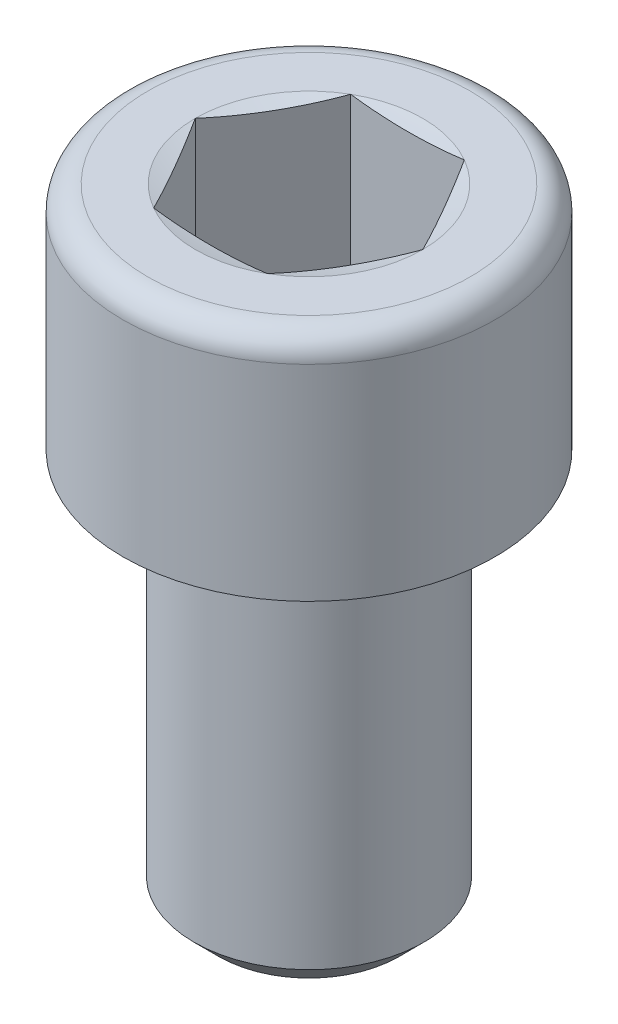
ISO-10303-21;
HEADER;
FILE_DESCRIPTION(('STEP AP214'),'2;1');
FILE_NAME('part.step','',(''),(''),'','','');
FILE_SCHEMA(('AUTOMOTIVE_DESIGN { 1 0 10303 214 1 1 1 1 }'));
ENDSEC;
DATA;
#1=APPLICATION_CONTEXT('core data for automotive mechanical design processes');
#2=APPLICATION_PROTOCOL_DEFINITION('international standard','automotive_design',2000,#1);
#3=PRODUCT_CONTEXT('',#1,'mechanical');
#4=PRODUCT('Part','Part','',(#3));
#5=PRODUCT_RELATED_PRODUCT_CATEGORY('part','',(#4));
#6=PRODUCT_DEFINITION_FORMATION('','',#4);
#7=PRODUCT_DEFINITION_CONTEXT('part definition',#1,'design');
#8=PRODUCT_DEFINITION('design','',#6,#7);
#9=PRODUCT_DEFINITION_SHAPE('','',#8);
#10=(LENGTH_UNIT() NAMED_UNIT(*) SI_UNIT(.MILLI.,.METRE.));
#11=(NAMED_UNIT(*) PLANE_ANGLE_UNIT() SI_UNIT($,.RADIAN.));
#12=(NAMED_UNIT(*) SI_UNIT($,.STERADIAN.) SOLID_ANGLE_UNIT());
#13=UNCERTAINTY_MEASURE_WITH_UNIT(LENGTH_MEASURE(1.E-05),#10,'distance_accuracy_value','');
#14=(GEOMETRIC_REPRESENTATION_CONTEXT(3) GLOBAL_UNCERTAINTY_ASSIGNED_CONTEXT((#13)) GLOBAL_UNIT_ASSIGNED_CONTEXT((#10,
#11,#12)) REPRESENTATION_CONTEXT('',''));
#15=CARTESIAN_POINT('',(0.,0.,0.));
#16=DIRECTION('',(0.,0.,1.));
#17=DIRECTION('',(1.,0.,0.));
#18=AXIS2_PLACEMENT_3D('',#15,#16,#17);
#19=CARTESIAN_POINT('',(-0.458271776169266,0.5842,-0.79375));
#20=DIRECTION('',(0.,-1.,0.));
#21=DIRECTION('',(0.,0.,-1.));
#22=AXIS2_PLACEMENT_3D('',#19,#20,#21);
#23=PLANE('',#22);
#24=DIRECTION('',(0.500000000000001,0.,0.866025403784438));
#25=VECTOR('',#24,1.);
#26=CARTESIAN_POINT('',(-0.458271776169265,0.5842,0.79375));
#27=LINE('',#26,#25);
#28=CARTESIAN_POINT('',(-0.916543552338531,0.5842,0.));
#29=VERTEX_POINT('',#28);
#30=CARTESIAN_POINT('',(-0.458271776169265,0.5842,0.79375));
#31=VERTEX_POINT('',#30);
#32=EDGE_CURVE('E233',#29,#31,#27,.T.);
#33=ORIENTED_EDGE('',*,*,#32,.T.);
#34=DIRECTION('',(1.,0.,0.));
#35=VECTOR('',#34,1.);
#36=CARTESIAN_POINT('',(0.458271776169265,0.5842,0.79375));
#37=LINE('',#36,#35);
#38=CARTESIAN_POINT('',(0.458271776169265,0.5842,0.79375));
#39=VERTEX_POINT('',#38);
#40=EDGE_CURVE('E237',#31,#39,#37,.T.);
#41=ORIENTED_EDGE('',*,*,#40,.T.);
#42=DIRECTION('',(0.500000000000001,0.,-0.866025403784438));
#43=VECTOR('',#42,1.);
#44=CARTESIAN_POINT('',(0.916543552338531,0.5842,0.));
#45=LINE('',#44,#43);
#46=CARTESIAN_POINT('',(0.916543552338531,0.5842,0.));
#47=VERTEX_POINT('',#46);
#48=EDGE_CURVE('E240',#39,#47,#45,.T.);
#49=ORIENTED_EDGE('',*,*,#48,.T.);
#50=DIRECTION('',(-0.5,0.,-0.866025403784439));
#51=VECTOR('',#50,1.);
#52=CARTESIAN_POINT('',(0.458271776169266,0.5842,-0.79375));
#53=LINE('',#52,#51);
#54=CARTESIAN_POINT('',(0.458271776169266,0.5842,-0.79375));
#55=VERTEX_POINT('',#54);
#56=EDGE_CURVE('E96',#47,#55,#53,.T.);
#57=ORIENTED_EDGE('',*,*,#56,.T.);
#58=DIRECTION('',(-1.,0.,0.));
#59=VECTOR('',#58,1.);
#60=CARTESIAN_POINT('',(-0.458271776169266,0.5842,-0.79375));
#61=LINE('',#60,#59);
#62=CARTESIAN_POINT('',(-0.458271776169266,0.5842,-0.79375));
#63=VERTEX_POINT('',#62);
#64=EDGE_CURVE('E223',#55,#63,#61,.T.);
#65=ORIENTED_EDGE('',*,*,#64,.T.);
#66=DIRECTION('',(-0.5,0.,0.866025403784439));
#67=VECTOR('',#66,1.);
#68=CARTESIAN_POINT('',(-0.916543552338531,0.5842,0.));
#69=LINE('',#68,#67);
#70=EDGE_CURVE('E228',#63,#29,#69,.T.);
#71=ORIENTED_EDGE('',*,*,#70,.T.);
#72=EDGE_LOOP('',(#33,#41,#49,#57,#65,#71));
#73=FACE_BOUND('',#72,.T.);
#74=ADVANCED_FACE('F17',(#73),#23,.F.);
#75=CARTESIAN_POINT('',(0.916543552338531,0.5842,0.));
#76=DIRECTION('',(0.866025403784438,0.,0.500000000000001));
#77=DIRECTION('',(0.500000000000001,0.,-0.866025403784438));
#78=AXIS2_PLACEMENT_3D('',#75,#76,#77);
#79=PLANE('',#78);
#80=CARTESIAN_POINT('',(0.458271776169265,1.8542,0.793749999999999));
#81=CARTESIAN_POINT('',(0.483248661763307,1.8474780820611,0.750488765136283));
#82=CARTESIAN_POINT('',(0.508301031542216,1.84190452607634,0.707096787829211));
#83=CARTESIAN_POINT('',(0.55850640758892,1.83299362218684,0.620138525703219));
#84=CARTESIAN_POINT('',(0.583659418390284,1.82965637618831,0.576572233031927));
#85=CARTESIAN_POINT('',(0.633869999938362,1.82517099343912,0.489604954713076));
#86=CARTESIAN_POINT('',(0.658927297851274,1.82401049145789,0.446204441627523));
#87=CARTESIAN_POINT('',(0.709041687153991,1.82381652270424,0.359403773164931));
#88=CARTESIAN_POINT('',(0.734098778375039,1.82478287239707,0.316003618080189));
#89=CARTESIAN_POINT('',(0.785416324989145,1.82896415657966,0.227119020024773));
#90=CARTESIAN_POINT('',(0.811674594503371,1.83228862539608,0.181638363107296));
#91=CARTESIAN_POINT('',(0.864164198555375,1.84138454465596,0.0907237020200508));
#92=CARTESIAN_POINT('',(0.890395214877819,1.8471633203989,0.0452902490154085));
#93=CARTESIAN_POINT('',(0.916543552338531,1.8542,0.));
#94=B_SPLINE_CURVE_WITH_KNOTS('',3,(#80,#81,#82,#83,#84,#85,#86,#87,#88,#89,#90,#91,#92,#93),
.UNSPECIFIED.,.F.,.F.,(4,2,2,2,2,2,4),(0.,0.151193525155671,0.302393939567057,0.452732811407607,
0.603058710398283,0.760867444094912,0.919150532165546),.UNSPECIFIED.);
#95=CARTESIAN_POINT('',(0.458271776169266,1.8542,0.79375));
#96=VERTEX_POINT('',#95);
#97=CARTESIAN_POINT('',(0.916543552338532,1.8542,0.));
#98=VERTEX_POINT('',#97);
#99=EDGE_CURVE('E79',#96,#98,#94,.T.);
#100=ORIENTED_EDGE('',*,*,#99,.T.);
#101=DIRECTION('',(0.,1.,0.));
#102=VECTOR('',#101,1.);
#103=CARTESIAN_POINT('',(0.916543552338531,0.5842,0.));
#104=LINE('',#103,#102);
#105=EDGE_CURVE('E82',#98,#47,#104,.F.);
#106=ORIENTED_EDGE('',*,*,#105,.T.);
#107=ORIENTED_EDGE('',*,*,#48,.F.);
#108=DIRECTION('',(0.,1.,0.));
#109=VECTOR('',#108,1.);
#110=CARTESIAN_POINT('',(0.458271776169265,0.5842,0.79375));
#111=LINE('',#110,#109);
#112=EDGE_CURVE('E75',#39,#96,#111,.T.);
#113=ORIENTED_EDGE('',*,*,#112,.T.);
#114=EDGE_LOOP('',(#100,#106,#107,#113));
#115=FACE_BOUND('',#114,.T.);
#116=ADVANCED_FACE('F81',(#115),#79,.F.);
#117=CARTESIAN_POINT('',(0.458271776169265,0.5842,0.79375));
#118=DIRECTION('',(0.,0.,1.));
#119=DIRECTION('',(1.,0.,0.));
#120=AXIS2_PLACEMENT_3D('',#117,#118,#119);
#121=PLANE('',#120);
#122=CARTESIAN_POINT('',(-0.458271776169266,1.8542,0.79375));
#123=CARTESIAN_POINT('',(-0.408318004981181,1.8474780820611,0.79375));
#124=CARTESIAN_POINT('',(-0.358213265423365,1.84190452607634,0.79375));
#125=CARTESIAN_POINT('',(-0.257802513329957,1.83299362218684,0.79375));
#126=CARTESIAN_POINT('',(-0.207496491727229,1.82965637618831,0.79375));
#127=CARTESIAN_POINT('',(-0.107075328631073,1.82517099343912,0.79375));
#128=CARTESIAN_POINT('',(-0.0569607328052492,1.82401049145789,0.79375));
#129=CARTESIAN_POINT('',(0.0432680458001849,1.82381652270424,0.79375));
#130=CARTESIAN_POINT('',(0.0933822282422793,1.82478287239707,0.79375));
#131=CARTESIAN_POINT('',(0.196017321470492,1.82896415657966,0.79375));
#132=CARTESIAN_POINT('',(0.248533860498945,1.83228862539608,0.79375));
#133=CARTESIAN_POINT('',(0.353513068602954,1.84138454465596,0.79375));
#134=CARTESIAN_POINT('',(0.405975101247843,1.8471633203989,0.79375));
#135=CARTESIAN_POINT('',(0.458271776169266,1.8542,0.793749999999999));
#136=B_SPLINE_CURVE_WITH_KNOTS('',3,(#122,#123,#124,#125,#126,#127,#128,#129,#130,#131,#132,
#133,#134,#135),.UNSPECIFIED.,.F.,.F.,(4,2,2,2,2,2,4),(0.,0.15119352515567,0.302393939567057,
0.452732811407607,0.603058710398283,0.760867444094913,0.919150532165548),.UNSPECIFIED.);
#137=CARTESIAN_POINT('',(-0.458271776169265,1.8542,0.79375));
#138=VERTEX_POINT('',#137);
#139=EDGE_CURVE('E87',#138,#96,#136,.T.);
#140=ORIENTED_EDGE('',*,*,#139,.T.);
#141=ORIENTED_EDGE('',*,*,#112,.F.);
#142=ORIENTED_EDGE('',*,*,#40,.F.);
#143=DIRECTION('',(0.,1.,0.));
#144=VECTOR('',#143,1.);
#145=CARTESIAN_POINT('',(-0.458271776169265,0.5842,0.79375));
#146=LINE('',#145,#144);
#147=EDGE_CURVE('E231',#31,#138,#146,.T.);
#148=ORIENTED_EDGE('',*,*,#147,.T.);
#149=EDGE_LOOP('',(#140,#141,#142,#148));
#150=FACE_BOUND('',#149,.T.);
#151=ADVANCED_FACE('F195',(#150),#121,.F.);
#152=CARTESIAN_POINT('',(-0.458271776169265,0.5842,0.79375));
#153=DIRECTION('',(-0.866025403784438,0.,0.500000000000001));
#154=DIRECTION('',(0.500000000000001,0.,0.866025403784438));
#155=AXIS2_PLACEMENT_3D('',#152,#153,#154);
#156=PLANE('',#155);
#157=CARTESIAN_POINT('',(-0.916543552338531,1.8542,0.));
#158=CARTESIAN_POINT('',(-0.891566666744489,1.8474780820611,0.0432612348637162));
#159=CARTESIAN_POINT('',(-0.866514296965581,1.84190452607634,0.0866532121707881));
#160=CARTESIAN_POINT('',(-0.816308920918877,1.83299362218684,0.173611474296781));
#161=CARTESIAN_POINT('',(-0.791155910117513,1.82965637618832,0.217177766968073));
#162=CARTESIAN_POINT('',(-0.740945328569435,1.82517099343912,0.304145045286924));
#163=CARTESIAN_POINT('',(-0.715888030656523,1.82401049145789,0.347545558372477));
#164=CARTESIAN_POINT('',(-0.665773641353806,1.82381652270424,0.434346226835069));
#165=CARTESIAN_POINT('',(-0.640716550132758,1.82478287239707,0.47774638191981));
#166=CARTESIAN_POINT('',(-0.589399003518652,1.82896415657966,0.566630979975227));
#167=CARTESIAN_POINT('',(-0.563140734004426,1.83228862539608,0.612111636892704));
#168=CARTESIAN_POINT('',(-0.510651129952422,1.84138454465596,0.703026297979949));
#169=CARTESIAN_POINT('',(-0.484420113629977,1.8471633203989,0.748459750984592));
#170=CARTESIAN_POINT('',(-0.458271776169266,1.8542,0.79375));
#171=B_SPLINE_CURVE_WITH_KNOTS('',3,(#157,#158,#159,#160,#161,#162,#163,#164,#165,#166,#167,
#168,#169,#170),.UNSPECIFIED.,.F.,.F.,(4,2,2,2,2,2,4),(0.,0.15119352515567,0.302393939567057,
0.452732811407607,0.603058710398283,0.760867444094912,0.919150532165547),.UNSPECIFIED.);
#172=CARTESIAN_POINT('',(-0.916543552338532,1.8542,0.));
#173=VERTEX_POINT('',#172);
#174=EDGE_CURVE('E179',#173,#138,#171,.T.);
#175=ORIENTED_EDGE('',*,*,#174,.T.);
#176=ORIENTED_EDGE('',*,*,#147,.F.);
#177=ORIENTED_EDGE('',*,*,#32,.F.);
#178=DIRECTION('',(0.,1.,0.));
#179=VECTOR('',#178,1.);
#180=CARTESIAN_POINT('',(-0.916543552338531,0.5842,0.));
#181=LINE('',#180,#179);
#182=EDGE_CURVE('E226',#29,#173,#181,.T.);
#183=ORIENTED_EDGE('',*,*,#182,.T.);
#184=EDGE_LOOP('',(#175,#176,#177,#183));
#185=FACE_BOUND('',#184,.T.);
#186=ADVANCED_FACE('F189',(#185),#156,.F.);
#187=CARTESIAN_POINT('',(-0.916543552338531,0.5842,0.));
#188=DIRECTION('',(-0.866025403784439,0.,-0.5));
#189=DIRECTION('',(-0.5,0.,0.866025403784439));
#190=AXIS2_PLACEMENT_3D('',#187,#188,#189);
#191=PLANE('',#190);
#192=CARTESIAN_POINT('',(-0.458271776169266,1.8542,-0.79375));
#193=CARTESIAN_POINT('',(-0.483248661763308,1.8474780820611,-0.750488765136284));
#194=CARTESIAN_POINT('',(-0.508301031542216,1.84190452607634,-0.707096787829212));
#195=CARTESIAN_POINT('',(-0.55850640758892,1.83299362218684,-0.62013852570322));
#196=CARTESIAN_POINT('',(-0.583659418390284,1.82965637618832,-0.576572233031928));
#197=CARTESIAN_POINT('',(-0.633869999938362,1.82517099343912,-0.489604954713077));
#198=CARTESIAN_POINT('',(-0.658927297851274,1.82401049145789,-0.446204441627524));
#199=CARTESIAN_POINT('',(-0.709041687153991,1.82381652270424,-0.359403773164932));
#200=CARTESIAN_POINT('',(-0.734098778375037,1.82478287239707,-0.31600361808019));
#201=CARTESIAN_POINT('',(-0.785416324989144,1.82896415657966,-0.227119020024773));
#202=CARTESIAN_POINT('',(-0.81167459450337,1.83228862539608,-0.181638363107296));
#203=CARTESIAN_POINT('',(-0.864164198555375,1.84138454465596,-0.0907237020200512));
#204=CARTESIAN_POINT('',(-0.89039521487782,1.8471633203989,-0.045290249015409));
#205=CARTESIAN_POINT('',(-0.916543552338531,1.8542,0.));
#206=B_SPLINE_CURVE_WITH_KNOTS('',3,(#192,#193,#194,#195,#196,#197,#198,#199,#200,#201,#202,
#203,#204,#205),.UNSPECIFIED.,.F.,.F.,(4,2,2,2,2,2,4),(0.,0.15119352515567,0.302393939567057,
0.452732811407607,0.603058710398282,0.760867444094912,0.919150532165547),.UNSPECIFIED.);
#207=CARTESIAN_POINT('',(-0.458271776169266,1.8542,-0.79375));
#208=VERTEX_POINT('',#207);
#209=EDGE_CURVE('E172',#208,#173,#206,.T.);
#210=ORIENTED_EDGE('',*,*,#209,.T.);
#211=ORIENTED_EDGE('',*,*,#182,.F.);
#212=ORIENTED_EDGE('',*,*,#70,.F.);
#213=DIRECTION('',(0.,1.,0.));
#214=VECTOR('',#213,1.);
#215=CARTESIAN_POINT('',(-0.458271776169266,0.5842,-0.79375));
#216=LINE('',#215,#214);
#217=EDGE_CURVE('E221',#63,#208,#216,.T.);
#218=ORIENTED_EDGE('',*,*,#217,.T.);
#219=EDGE_LOOP('',(#210,#211,#212,#218));
#220=FACE_BOUND('',#219,.T.);
#221=ADVANCED_FACE('F185',(#220),#191,.F.);
#222=CARTESIAN_POINT('',(-0.458271776169266,0.5842,-0.79375));
#223=DIRECTION('',(0.,0.,-1.));
#224=DIRECTION('',(-1.,0.,0.));
#225=AXIS2_PLACEMENT_3D('',#222,#223,#224);
#226=PLANE('',#225);
#227=CARTESIAN_POINT('',(0.458271776169266,1.8542,-0.793750000000001));
#228=CARTESIAN_POINT('',(0.408318004981182,1.8474780820611,-0.79375));
#229=CARTESIAN_POINT('',(0.358213265423366,1.84190452607634,-0.79375));
#230=CARTESIAN_POINT('',(0.257802513329958,1.83299362218684,-0.79375));
#231=CARTESIAN_POINT('',(0.207496491727229,1.82965637618831,-0.79375));
#232=CARTESIAN_POINT('',(0.107075328631074,1.82517099343912,-0.79375));
#233=CARTESIAN_POINT('',(0.0569607328052498,1.82401049145789,-0.79375));
#234=CARTESIAN_POINT('',(-0.0432680458001842,1.82381652270424,-0.79375));
#235=CARTESIAN_POINT('',(-0.0933822282422787,1.82478287239707,-0.79375));
#236=CARTESIAN_POINT('',(-0.196017321470491,1.82896415657966,-0.79375));
#237=CARTESIAN_POINT('',(-0.248533860498944,1.83228862539608,-0.79375));
#238=CARTESIAN_POINT('',(-0.353513068602954,1.84138454465596,-0.79375));
#239=CARTESIAN_POINT('',(-0.405975101247843,1.8471633203989,-0.79375));
#240=CARTESIAN_POINT('',(-0.458271776169266,1.8542,-0.79375));
#241=B_SPLINE_CURVE_WITH_KNOTS('',3,(#227,#228,#229,#230,#231,#232,#233,#234,#235,#236,#237,
#238,#239,#240),.UNSPECIFIED.,.F.,.F.,(4,2,2,2,2,2,4),(0.,0.151193525155671,0.302393939567057,
0.452732811407607,0.603058710398283,0.760867444094913,0.919150532165548),.UNSPECIFIED.);
#242=CARTESIAN_POINT('',(0.458271776169266,1.8542,-0.79375));
#243=VERTEX_POINT('',#242);
#244=EDGE_CURVE('E112',#243,#208,#241,.T.);
#245=ORIENTED_EDGE('',*,*,#244,.T.);
#246=ORIENTED_EDGE('',*,*,#217,.F.);
#247=ORIENTED_EDGE('',*,*,#64,.F.);
#248=DIRECTION('',(0.,1.,0.));
#249=VECTOR('',#248,1.);
#250=CARTESIAN_POINT('',(0.458271776169266,0.5842,-0.79375));
#251=LINE('',#250,#249);
#252=EDGE_CURVE('E97',#55,#243,#251,.T.);
#253=ORIENTED_EDGE('',*,*,#252,.T.);
#254=EDGE_LOOP('',(#245,#246,#247,#253));
#255=FACE_BOUND('',#254,.T.);
#256=ADVANCED_FACE('F188',(#255),#226,.F.);
#257=CARTESIAN_POINT('',(0.458271776169266,0.5842,-0.79375));
#258=DIRECTION('',(0.866025403784439,0.,-0.5));
#259=DIRECTION('',(-0.5,0.,-0.866025403784439));
#260=AXIS2_PLACEMENT_3D('',#257,#258,#259);
#261=PLANE('',#260);
#262=CARTESIAN_POINT('',(0.916543552338531,1.8542,0.));
#263=CARTESIAN_POINT('',(0.891566666744489,1.8474780820611,-0.0432612348637159));
#264=CARTESIAN_POINT('',(0.866514296965581,1.84190452607634,-0.0866532121707878));
#265=CARTESIAN_POINT('',(0.816308920918877,1.83299362218684,-0.173611474296781));
#266=CARTESIAN_POINT('',(0.791155910117513,1.82965637618831,-0.217177766968072));
#267=CARTESIAN_POINT('',(0.740945328569435,1.82517099343912,-0.304145045286923));
#268=CARTESIAN_POINT('',(0.715888030656523,1.82401049145789,-0.347545558372477));
#269=CARTESIAN_POINT('',(0.665773641353806,1.82381652270424,-0.434346226835069));
#270=CARTESIAN_POINT('',(0.640716550132759,1.82478287239707,-0.477746381919811));
#271=CARTESIAN_POINT('',(0.589399003518653,1.82896415657966,-0.566630979975227));
#272=CARTESIAN_POINT('',(0.563140734004426,1.83228862539608,-0.612111636892704));
#273=CARTESIAN_POINT('',(0.510651129952422,1.84138454465596,-0.703026297979949));
#274=CARTESIAN_POINT('',(0.484420113629977,1.8471633203989,-0.748459750984591));
#275=CARTESIAN_POINT('',(0.458271776169266,1.8542,-0.79375));
#276=B_SPLINE_CURVE_WITH_KNOTS('',3,(#262,#263,#264,#265,#266,#267,#268,#269,#270,#271,#272,
#273,#274,#275),.UNSPECIFIED.,.F.,.F.,(4,2,2,2,2,2,4),(0.,0.151193525155671,0.302393939567057,
0.452732811407607,0.603058710398283,0.760867444094912,0.919150532165546),.UNSPECIFIED.);
#277=EDGE_CURVE('E94',#98,#243,#276,.T.);
#278=ORIENTED_EDGE('',*,*,#277,.T.);
#279=ORIENTED_EDGE('',*,*,#252,.F.);
#280=ORIENTED_EDGE('',*,*,#56,.F.);
#281=ORIENTED_EDGE('',*,*,#105,.F.);
#282=EDGE_LOOP('',(#278,#279,#280,#281));
#283=FACE_BOUND('',#282,.T.);
#284=ADVANCED_FACE('F91',(#283),#261,.F.);
#285=CARTESIAN_POINT('',(-0.136750601984079,4.75108159139746,0.));
#286=DIRECTION('',(0.,0.,1.));
#287=DIRECTION('',(-1.,0.,0.));
#288=AXIS2_PLACEMENT_3D('',#285,#286,#287);
#289=CIRCLE('',#288,3.);
#290=TRIMMED_CURVE('',#289,(PARAMETER_VALUE(-1.61639566159118)),
(PARAMETER_VALUE(1.61639566159118)),.T.,.PARAMETER.);
#291=CARTESIAN_POINT('',(0.,4.75108159139746,0.));
#292=DIRECTION('',(0.,1.,0.));
#293=AXIS1_PLACEMENT('',#291,#292);
#294=SURFACE_OF_REVOLUTION('',#290,#293);
#295=ORIENTED_EDGE('',*,*,#99,.F.);
#296=CARTESIAN_POINT('',(0.,1.8542,0.));
#297=DIRECTION('',(0.,1.,0.));
#298=DIRECTION('',(-1.,0.,0.));
#299=AXIS2_PLACEMENT_3D('',#296,#297,#298);
#300=CIRCLE('',#299,0.916543552338533);
#301=EDGE_CURVE('E100',#98,#96,#300,.F.);
#302=ORIENTED_EDGE('',*,*,#301,.F.);
#303=EDGE_LOOP('',(#295,#302));
#304=FACE_BOUND('',#303,.T.);
#305=ADVANCED_FACE('F101',(#304),#294,.T.);
#306=CARTESIAN_POINT('',(-0.136750601984079,4.75108159139746,0.));
#307=DIRECTION('',(0.,0.,1.));
#308=DIRECTION('',(-1.,0.,0.));
#309=AXIS2_PLACEMENT_3D('',#306,#307,#308);
#310=CIRCLE('',#309,3.);
#311=TRIMMED_CURVE('',#310,(PARAMETER_VALUE(-1.61639566159118)),
(PARAMETER_VALUE(1.61639566159118)),.T.,.PARAMETER.);
#312=CARTESIAN_POINT('',(0.,4.75108159139746,0.));
#313=DIRECTION('',(0.,1.,0.));
#314=AXIS1_PLACEMENT('',#312,#313);
#315=SURFACE_OF_REVOLUTION('',#311,#314);
#316=ORIENTED_EDGE('',*,*,#139,.F.);
#317=CARTESIAN_POINT('',(0.,1.8542,0.));
#318=DIRECTION('',(0.,1.,0.));
#319=DIRECTION('',(-1.,0.,0.));
#320=AXIS2_PLACEMENT_3D('',#317,#318,#319);
#321=CIRCLE('',#320,0.916543552338533);
#322=EDGE_CURVE('E105',#96,#138,#321,.F.);
#323=ORIENTED_EDGE('',*,*,#322,.F.);
#324=EDGE_LOOP('',(#316,#323));
#325=FACE_BOUND('',#324,.T.);
#326=ADVANCED_FACE('F207',(#325),#315,.T.);
#327=CARTESIAN_POINT('',(-0.136750601984079,4.75108159139746,0.));
#328=DIRECTION('',(0.,0.,1.));
#329=DIRECTION('',(-1.,0.,0.));
#330=AXIS2_PLACEMENT_3D('',#327,#328,#329);
#331=CIRCLE('',#330,3.);
#332=TRIMMED_CURVE('',#331,(PARAMETER_VALUE(-1.61639566159118)),
(PARAMETER_VALUE(1.61639566159118)),.T.,.PARAMETER.);
#333=CARTESIAN_POINT('',(0.,4.75108159139746,0.));
#334=DIRECTION('',(0.,1.,0.));
#335=AXIS1_PLACEMENT('',#333,#334);
#336=SURFACE_OF_REVOLUTION('',#332,#335);
#337=ORIENTED_EDGE('',*,*,#174,.F.);
#338=CARTESIAN_POINT('',(0.,1.8542,0.));
#339=DIRECTION('',(0.,1.,0.));
#340=DIRECTION('',(-1.,0.,0.));
#341=AXIS2_PLACEMENT_3D('',#338,#339,#340);
#342=CIRCLE('',#341,0.916543552338531);
#343=EDGE_CURVE('E127',#138,#173,#342,.F.);
#344=ORIENTED_EDGE('',*,*,#343,.F.);
#345=EDGE_LOOP('',(#337,#344));
#346=FACE_BOUND('',#345,.T.);
#347=ADVANCED_FACE('F168',(#346),#336,.T.);
#348=CARTESIAN_POINT('',(-0.136750601984079,4.75108159139746,0.));
#349=DIRECTION('',(0.,0.,1.));
#350=DIRECTION('',(-1.,0.,0.));
#351=AXIS2_PLACEMENT_3D('',#348,#349,#350);
#352=CIRCLE('',#351,3.);
#353=TRIMMED_CURVE('',#352,(PARAMETER_VALUE(-1.61639566159118)),
(PARAMETER_VALUE(1.61639566159118)),.T.,.PARAMETER.);
#354=CARTESIAN_POINT('',(0.,4.75108159139746,0.));
#355=DIRECTION('',(0.,1.,0.));
#356=AXIS1_PLACEMENT('',#354,#355);
#357=SURFACE_OF_REVOLUTION('',#353,#356);
#358=ORIENTED_EDGE('',*,*,#209,.F.);
#359=CARTESIAN_POINT('',(0.,1.8542,0.));
#360=DIRECTION('',(0.,1.,0.));
#361=DIRECTION('',(-1.,0.,0.));
#362=AXIS2_PLACEMENT_3D('',#359,#360,#361);
#363=CIRCLE('',#362,0.916543552338533);
#364=EDGE_CURVE('E120',#173,#208,#363,.F.);
#365=ORIENTED_EDGE('',*,*,#364,.F.);
#366=EDGE_LOOP('',(#358,#365));
#367=FACE_BOUND('',#366,.T.);
#368=ADVANCED_FACE('F164',(#367),#357,.T.);
#369=CARTESIAN_POINT('',(-0.136750601984079,4.75108159139746,0.));
#370=DIRECTION('',(0.,0.,1.));
#371=DIRECTION('',(-1.,0.,0.));
#372=AXIS2_PLACEMENT_3D('',#369,#370,#371);
#373=CIRCLE('',#372,3.);
#374=TRIMMED_CURVE('',#373,(PARAMETER_VALUE(-1.61639566159118)),
(PARAMETER_VALUE(1.61639566159118)),.T.,.PARAMETER.);
#375=CARTESIAN_POINT('',(0.,4.75108159139746,0.));
#376=DIRECTION('',(0.,1.,0.));
#377=AXIS1_PLACEMENT('',#375,#376);
#378=SURFACE_OF_REVOLUTION('',#374,#377);
#379=ORIENTED_EDGE('',*,*,#244,.F.);
#380=CARTESIAN_POINT('',(0.,1.8542,0.));
#381=DIRECTION('',(0.,1.,0.));
#382=DIRECTION('',(-1.,0.,0.));
#383=AXIS2_PLACEMENT_3D('',#380,#381,#382);
#384=CIRCLE('',#383,0.916543552338531);
#385=EDGE_CURVE('E117',#208,#243,#384,.F.);
#386=ORIENTED_EDGE('',*,*,#385,.F.);
#387=EDGE_LOOP('',(#379,#386));
#388=FACE_BOUND('',#387,.T.);
#389=ADVANCED_FACE('F148',(#388),#378,.T.);
#390=CARTESIAN_POINT('',(-0.136750601984079,4.75108159139746,0.));
#391=DIRECTION('',(0.,0.,1.));
#392=DIRECTION('',(-1.,0.,0.));
#393=AXIS2_PLACEMENT_3D('',#390,#391,#392);
#394=CIRCLE('',#393,3.);
#395=TRIMMED_CURVE('',#394,(PARAMETER_VALUE(-1.61639566159118)),
(PARAMETER_VALUE(1.61639566159118)),.T.,.PARAMETER.);
#396=CARTESIAN_POINT('',(0.,4.75108159139746,0.));
#397=DIRECTION('',(0.,1.,0.));
#398=AXIS1_PLACEMENT('',#396,#397);
#399=SURFACE_OF_REVOLUTION('',#395,#398);
#400=ORIENTED_EDGE('',*,*,#277,.F.);
#401=CARTESIAN_POINT('',(0.,1.8542,0.));
#402=DIRECTION('',(0.,1.,0.));
#403=DIRECTION('',(-1.,0.,0.));
#404=AXIS2_PLACEMENT_3D('',#401,#402,#403);
#405=CIRCLE('',#404,0.916543552338531);
#406=EDGE_CURVE('E110',#243,#98,#405,.F.);
#407=ORIENTED_EDGE('',*,*,#406,.F.);
#408=EDGE_LOOP('',(#400,#407));
#409=FACE_BOUND('',#408,.T.);
#410=ADVANCED_FACE('F109',(#409),#399,.T.);
#411=CARTESIAN_POINT('',(0.,1.8542,0.));
#412=DIRECTION('',(0.,1.,0.));
#413=DIRECTION('',(0.,0.,1.));
#414=AXIS2_PLACEMENT_3D('',#411,#412,#413);
#415=PLANE('',#414);
#416=CARTESIAN_POINT('',(0.,1.8542,0.));
#417=DIRECTION('',(0.,-1.,0.));
#418=DIRECTION('',(0.,0.,-1.));
#419=AXIS2_PLACEMENT_3D('',#416,#417,#418);
#420=CIRCLE('',#419,1.2986);
#421=CARTESIAN_POINT('',(0.,1.8542,-1.2986));
#422=VERTEX_POINT('',#421);
#423=CARTESIAN_POINT('',(0.,1.8542,1.2986));
#424=VERTEX_POINT('',#423);
#425=EDGE_CURVE('E36',#422,#424,#420,.T.);
#426=ORIENTED_EDGE('',*,*,#425,.F.);
#427=CARTESIAN_POINT('',(0.,1.8542,0.));
#428=DIRECTION('',(0.,-1.,0.));
#429=DIRECTION('',(0.,0.,1.));
#430=AXIS2_PLACEMENT_3D('',#427,#428,#429);
#431=CIRCLE('',#430,1.2986);
#432=EDGE_CURVE('E119',#424,#422,#431,.T.);
#433=ORIENTED_EDGE('',*,*,#432,.F.);
#434=EDGE_LOOP('',(#426,#433));
#435=FACE_BOUND('',#434,.T.);
#436=ORIENTED_EDGE('',*,*,#385,.T.);
#437=ORIENTED_EDGE('',*,*,#406,.T.);
#438=ORIENTED_EDGE('',*,*,#301,.T.);
#439=ORIENTED_EDGE('',*,*,#322,.T.);
#440=ORIENTED_EDGE('',*,*,#343,.T.);
#441=ORIENTED_EDGE('',*,*,#364,.T.);
#442=EDGE_LOOP('',(#436,#437,#438,#439,#440,#441));
#443=FACE_BOUND('',#442,.T.);
#444=ADVANCED_FACE('F114',(#435,#443),#415,.T.);
#445=CARTESIAN_POINT('',(0.,1.6542,0.));
#446=DIRECTION('',(0.,1.,0.));
#447=DIRECTION('',(0.,0.,1.));
#448=AXIS2_PLACEMENT_3D('',#445,#446,#447);
#449=TOROIDAL_SURFACE('',#448,1.2986,0.2);
#450=CARTESIAN_POINT('',(0.,1.6542,0.));
#451=DIRECTION('',(0.,-1.,0.));
#452=DIRECTION('',(0.,0.,-1.));
#453=AXIS2_PLACEMENT_3D('',#450,#451,#452);
#454=CIRCLE('',#453,1.4986);
#455=CARTESIAN_POINT('',(0.,1.6542,-1.4986));
#456=VERTEX_POINT('',#455);
#457=EDGE_CURVE('E265',#456,#456,#454,.T.);
#458=ORIENTED_EDGE('',*,*,#457,.F.);
#459=EDGE_LOOP('',(#458));
#460=FACE_BOUND('',#459,.T.);
#461=ORIENTED_EDGE('',*,*,#432,.T.);
#462=ORIENTED_EDGE('',*,*,#425,.T.);
#463=EDGE_LOOP('',(#461,#462));
#464=FACE_BOUND('',#463,.T.);
#465=ADVANCED_FACE('F276',(#460,#464),#449,.T.);
#466=CARTESIAN_POINT('',(0.,-3.175,0.));
#467=DIRECTION('',(0.,-1.,0.));
#468=DIRECTION('',(0.,0.,-1.));
#469=AXIS2_PLACEMENT_3D('',#466,#467,#468);
#470=PLANE('',#469);
#471=CARTESIAN_POINT('',(0.,-3.17499999999882,0.));
#472=DIRECTION('',(0.,1.,0.));
#473=DIRECTION('',(0.,0.,1.));
#474=AXIS2_PLACEMENT_3D('',#471,#472,#473);
#475=CIRCLE('',#474,0.727099999949132);
#476=CARTESIAN_POINT('',(0.,-3.17499999999882,0.727099999949132));
#477=VERTEX_POINT('',#476);
#478=EDGE_CURVE('E123',#477,#477,#475,.T.);
#479=ORIENTED_EDGE('',*,*,#478,.F.);
#480=EDGE_LOOP('',(#479));
#481=FACE_BOUND('',#480,.T.);
#482=ADVANCED_FACE('F280',(#481),#470,.T.);
#483=CARTESIAN_POINT('',(0.,1.8542,0.));
#484=DIRECTION('',(0.,-1.,0.));
#485=DIRECTION('',(0.,0.,-1.));
#486=AXIS2_PLACEMENT_3D('',#483,#484,#485);
#487=CYLINDRICAL_SURFACE('',#486,1.4986);
#488=ORIENTED_EDGE('',*,*,#457,.T.);
#489=EDGE_LOOP('',(#488));
#490=FACE_BOUND('',#489,.T.);
#491=CARTESIAN_POINT('',(0.,0.,0.));
#492=DIRECTION('',(0.,-1.,0.));
#493=DIRECTION('',(0.,0.,-1.));
#494=AXIS2_PLACEMENT_3D('',#491,#492,#493);
#495=CIRCLE('',#494,1.4986);
#496=CARTESIAN_POINT('',(0.,0.,-1.4986));
#497=VERTEX_POINT('',#496);
#498=EDGE_CURVE('E258',#497,#497,#495,.F.);
#499=ORIENTED_EDGE('',*,*,#498,.T.);
#500=EDGE_LOOP('',(#499));
#501=FACE_BOUND('',#500,.T.);
#502=ADVANCED_FACE('F285',(#490,#501),#487,.T.);
#503=CARTESIAN_POINT('',(0.,-2.97499999999218,0.));
#504=DIRECTION('',(0.,1.,0.));
#505=DIRECTION('',(0.,0.,1.));
#506=AXIS2_PLACEMENT_3D('',#503,#504,#505);
#507=CONICAL_SURFACE('',#506,0.927099999955772,0.785398163397448);
#508=CARTESIAN_POINT('',(0.,-2.975,0.));
#509=DIRECTION('',(0.,1.,0.));
#510=DIRECTION('',(0.,0.,1.));
#511=AXIS2_PLACEMENT_3D('',#508,#509,#510);
#512=CIRCLE('',#511,0.9271);
#513=CARTESIAN_POINT('',(0.,-2.975,0.9271));
#514=VERTEX_POINT('',#513);
#515=EDGE_CURVE('E28',#514,#514,#512,.T.);
#516=ORIENTED_EDGE('',*,*,#515,.F.);
#517=EDGE_LOOP('',(#516));
#518=FACE_BOUND('',#517,.T.);
#519=ORIENTED_EDGE('',*,*,#478,.T.);
#520=EDGE_LOOP('',(#519));
#521=FACE_BOUND('',#520,.T.);
#522=ADVANCED_FACE('F289',(#518,#521),#507,.T.);
#523=CARTESIAN_POINT('',(0.,0.,0.));
#524=DIRECTION('',(0.,1.,0.));
#525=DIRECTION('',(0.,0.,1.));
#526=AXIS2_PLACEMENT_3D('',#523,#524,#525);
#527=PLANE('',#526);
#528=CARTESIAN_POINT('',(0.,0.,0.));
#529=DIRECTION('',(0.,1.,0.));
#530=DIRECTION('',(0.,0.,1.));
#531=AXIS2_PLACEMENT_3D('',#528,#529,#530);
#532=CIRCLE('',#531,0.9271);
#533=CARTESIAN_POINT('',(0.,0.,0.9271));
#534=VERTEX_POINT('',#533);
#535=EDGE_CURVE('E11',#534,#534,#532,.F.);
#536=ORIENTED_EDGE('',*,*,#535,.F.);
#537=EDGE_LOOP('',(#536));
#538=FACE_BOUND('',#537,.T.);
#539=ORIENTED_EDGE('',*,*,#498,.F.);
#540=EDGE_LOOP('',(#539));
#541=FACE_BOUND('',#540,.T.);
#542=ADVANCED_FACE('F292',(#538,#541),#527,.F.);
#543=CARTESIAN_POINT('',(0.,-3.175,0.));
#544=DIRECTION('',(0.,1.,0.));
#545=DIRECTION('',(0.,0.,1.));
#546=AXIS2_PLACEMENT_3D('',#543,#544,#545);
#547=CYLINDRICAL_SURFACE('',#546,0.9271);
#548=ORIENTED_EDGE('',*,*,#535,.T.);
#549=EDGE_LOOP('',(#548));
#550=FACE_BOUND('',#549,.T.);
#551=ORIENTED_EDGE('',*,*,#515,.T.);
#552=EDGE_LOOP('',(#551));
#553=FACE_BOUND('',#552,.T.);
#554=ADVANCED_FACE('F296',(#550,#553),#547,.T.);
#555=CLOSED_SHELL('',(#74,#116,#151,#186,#221,#256,#284,#305,#326,#347,#368,#389,#410,#444,#465,
#482,#502,#522,#542,#554));
#556=MANIFOLD_SOLID_BREP('B1',#555);
#557=ADVANCED_BREP_SHAPE_REPRESENTATION('',(#18,#556),#14);
#558=SHAPE_DEFINITION_REPRESENTATION(#9,#557);
ENDSEC;
END-ISO-10303-21;
